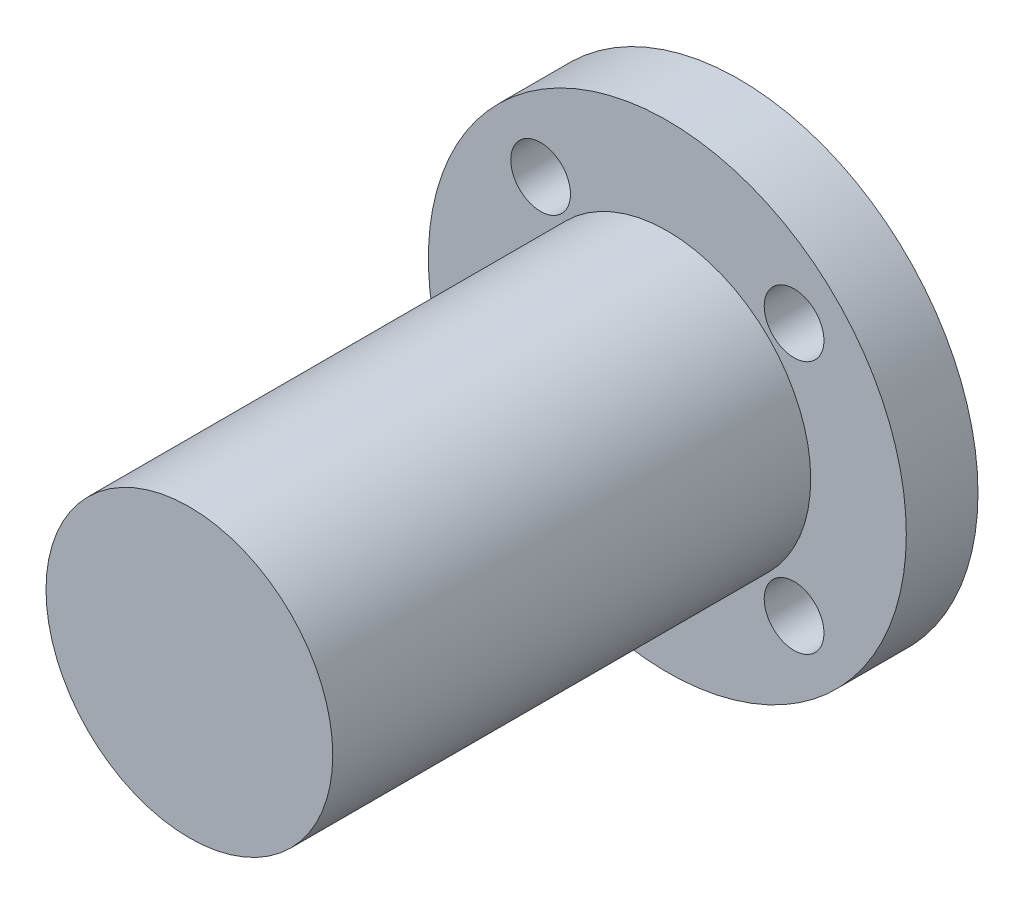
ISO-10303-21;
HEADER;
FILE_DESCRIPTION(('STEP AP214'),'2;1');
FILE_NAME('part.step','',(''),(''),'','','');
FILE_SCHEMA(('AUTOMOTIVE_DESIGN { 1 0 10303 214 1 1 1 1 }'));
ENDSEC;
DATA;
#1=APPLICATION_CONTEXT('core data for automotive mechanical design processes');
#2=APPLICATION_PROTOCOL_DEFINITION('international standard','automotive_design',2000,#1);
#3=PRODUCT_CONTEXT('',#1,'mechanical');
#4=PRODUCT('Part','Part','',(#3));
#5=PRODUCT_RELATED_PRODUCT_CATEGORY('part','',(#4));
#6=PRODUCT_DEFINITION_FORMATION('','',#4);
#7=PRODUCT_DEFINITION_CONTEXT('part definition',#1,'design');
#8=PRODUCT_DEFINITION('design','',#6,#7);
#9=PRODUCT_DEFINITION_SHAPE('','',#8);
#10=(LENGTH_UNIT() NAMED_UNIT(*) SI_UNIT(.MILLI.,.METRE.));
#11=(NAMED_UNIT(*) PLANE_ANGLE_UNIT() SI_UNIT($,.RADIAN.));
#12=(NAMED_UNIT(*) SI_UNIT($,.STERADIAN.) SOLID_ANGLE_UNIT());
#13=UNCERTAINTY_MEASURE_WITH_UNIT(LENGTH_MEASURE(1.E-05),#10,'distance_accuracy_value','');
#14=(GEOMETRIC_REPRESENTATION_CONTEXT(3) GLOBAL_UNCERTAINTY_ASSIGNED_CONTEXT((#13)) GLOBAL_UNIT_ASSIGNED_CONTEXT((#10,
#11,#12)) REPRESENTATION_CONTEXT('',''));
#15=CARTESIAN_POINT('',(0.,0.,0.));
#16=DIRECTION('',(0.,0.,1.));
#17=DIRECTION('',(1.,0.,0.));
#18=AXIS2_PLACEMENT_3D('',#15,#16,#17);
#19=CARTESIAN_POINT('',(0.,0.,3.));
#20=DIRECTION('',(0.,0.,-1.));
#21=DIRECTION('',(-1.,0.,0.));
#22=AXIS2_PLACEMENT_3D('',#19,#20,#21);
#23=CYLINDRICAL_SURFACE('',#22,10.);
#24=CARTESIAN_POINT('',(0.,0.,3.));
#25=DIRECTION('',(0.,0.,1.));
#26=DIRECTION('',(1.,0.,0.));
#27=AXIS2_PLACEMENT_3D('',#24,#25,#26);
#28=CIRCLE('',#27,10.);
#29=CARTESIAN_POINT('',(10.,0.,3.));
#30=VERTEX_POINT('',#29);
#31=EDGE_CURVE('E42',#30,#30,#28,.T.);
#32=ORIENTED_EDGE('',*,*,#31,.F.);
#33=EDGE_LOOP('',(#32));
#34=FACE_BOUND('',#33,.T.);
#35=CARTESIAN_POINT('',(0.,0.,0.));
#36=DIRECTION('',(0.,0.,1.));
#37=DIRECTION('',(1.,0.,0.));
#38=AXIS2_PLACEMENT_3D('',#35,#36,#37);
#39=CIRCLE('',#38,10.);
#40=CARTESIAN_POINT('',(10.,0.,0.));
#41=VERTEX_POINT('',#40);
#42=EDGE_CURVE('E38',#41,#41,#39,.T.);
#43=ORIENTED_EDGE('',*,*,#42,.T.);
#44=EDGE_LOOP('',(#43));
#45=FACE_BOUND('',#44,.T.);
#46=ADVANCED_FACE('F35',(#34,#45),#23,.T.);
#47=CARTESIAN_POINT('',(0.,0.,3.));
#48=DIRECTION('',(0.,0.,1.));
#49=DIRECTION('',(1.,0.,0.));
#50=AXIS2_PLACEMENT_3D('',#47,#48,#49);
#51=PLANE('',#50);
#52=CARTESIAN_POINT('',(5.3033008588991,-5.30330085889911,3.));
#53=DIRECTION('',(0.,0.,1.));
#54=DIRECTION('',(1.,0.,0.));
#55=AXIS2_PLACEMENT_3D('',#52,#53,#54);
#56=CIRCLE('',#55,1.25);
#57=CARTESIAN_POINT('',(6.5533008588991,-5.30330085889911,3.));
#58=VERTEX_POINT('',#57);
#59=EDGE_CURVE('E61',#58,#58,#56,.F.);
#60=ORIENTED_EDGE('',*,*,#59,.T.);
#61=EDGE_LOOP('',(#60));
#62=FACE_BOUND('',#61,.T.);
#63=CARTESIAN_POINT('',(-5.30330085889911,-5.30330085889911,3.));
#64=DIRECTION('',(0.,0.,1.));
#65=DIRECTION('',(1.,0.,0.));
#66=AXIS2_PLACEMENT_3D('',#63,#64,#65);
#67=CIRCLE('',#66,1.25);
#68=CARTESIAN_POINT('',(-4.05330085889911,-5.30330085889911,3.));
#69=VERTEX_POINT('',#68);
#70=EDGE_CURVE('E67',#69,#69,#67,.F.);
#71=ORIENTED_EDGE('',*,*,#70,.T.);
#72=EDGE_LOOP('',(#71));
#73=FACE_BOUND('',#72,.T.);
#74=CARTESIAN_POINT('',(-5.30330085889911,5.30330085889911,3.));
#75=DIRECTION('',(0.,0.,1.));
#76=DIRECTION('',(1.,0.,0.));
#77=AXIS2_PLACEMENT_3D('',#74,#75,#76);
#78=CIRCLE('',#77,1.25);
#79=CARTESIAN_POINT('',(-4.05330085889911,5.30330085889911,3.));
#80=VERTEX_POINT('',#79);
#81=EDGE_CURVE('E55',#80,#80,#78,.F.);
#82=ORIENTED_EDGE('',*,*,#81,.T.);
#83=EDGE_LOOP('',(#82));
#84=FACE_BOUND('',#83,.T.);
#85=CARTESIAN_POINT('',(5.3033008588991,5.3033008588991,3.));
#86=DIRECTION('',(0.,0.,1.));
#87=DIRECTION('',(1.,0.,0.));
#88=AXIS2_PLACEMENT_3D('',#85,#86,#87);
#89=CIRCLE('',#88,1.25);
#90=CARTESIAN_POINT('',(6.5533008588991,5.3033008588991,3.));
#91=VERTEX_POINT('',#90);
#92=EDGE_CURVE('E52',#91,#91,#89,.F.);
#93=ORIENTED_EDGE('',*,*,#92,.T.);
#94=EDGE_LOOP('',(#93));
#95=FACE_BOUND('',#94,.T.);
#96=CARTESIAN_POINT('',(0.,0.,3.));
#97=DIRECTION('',(0.,0.,1.));
#98=DIRECTION('',(1.,0.,0.));
#99=AXIS2_PLACEMENT_3D('',#96,#97,#98);
#100=CIRCLE('',#99,6.);
#101=CARTESIAN_POINT('',(6.,0.,3.));
#102=VERTEX_POINT('',#101);
#103=EDGE_CURVE('E10',#102,#102,#100,.T.);
#104=ORIENTED_EDGE('',*,*,#103,.F.);
#105=EDGE_LOOP('',(#104));
#106=FACE_BOUND('',#105,.T.);
#107=ORIENTED_EDGE('',*,*,#31,.T.);
#108=EDGE_LOOP('',(#107));
#109=FACE_BOUND('',#108,.T.);
#110=ADVANCED_FACE('F76',(#62,#73,#84,#95,#106,#109),#51,.T.);
#111=CARTESIAN_POINT('',(0.,0.,0.));
#112=DIRECTION('',(0.,0.,1.));
#113=DIRECTION('',(1.,0.,0.));
#114=AXIS2_PLACEMENT_3D('',#111,#112,#113);
#115=PLANE('',#114);
#116=CARTESIAN_POINT('',(5.3033008588991,-5.30330085889911,0.));
#117=DIRECTION('',(0.,0.,-1.));
#118=DIRECTION('',(-1.,0.,0.));
#119=AXIS2_PLACEMENT_3D('',#116,#117,#118);
#120=CIRCLE('',#119,1.25);
#121=CARTESIAN_POINT('',(4.0533008588991,-5.30330085889911,0.));
#122=VERTEX_POINT('',#121);
#123=EDGE_CURVE('E58',#122,#122,#120,.T.);
#124=ORIENTED_EDGE('',*,*,#123,.F.);
#125=EDGE_LOOP('',(#124));
#126=FACE_BOUND('',#125,.T.);
#127=CARTESIAN_POINT('',(-5.30330085889911,-5.30330085889911,0.));
#128=DIRECTION('',(0.,0.,-1.));
#129=DIRECTION('',(-1.,0.,0.));
#130=AXIS2_PLACEMENT_3D('',#127,#128,#129);
#131=CIRCLE('',#130,1.25);
#132=CARTESIAN_POINT('',(-6.55330085889911,-5.30330085889911,0.));
#133=VERTEX_POINT('',#132);
#134=EDGE_CURVE('E64',#133,#133,#131,.T.);
#135=ORIENTED_EDGE('',*,*,#134,.F.);
#136=EDGE_LOOP('',(#135));
#137=FACE_BOUND('',#136,.T.);
#138=CARTESIAN_POINT('',(-5.30330085889911,5.30330085889911,0.));
#139=DIRECTION('',(0.,0.,-1.));
#140=DIRECTION('',(-1.,0.,0.));
#141=AXIS2_PLACEMENT_3D('',#138,#139,#140);
#142=CIRCLE('',#141,1.25);
#143=CARTESIAN_POINT('',(-6.55330085889911,5.30330085889911,0.));
#144=VERTEX_POINT('',#143);
#145=EDGE_CURVE('E70',#144,#144,#142,.T.);
#146=ORIENTED_EDGE('',*,*,#145,.F.);
#147=EDGE_LOOP('',(#146));
#148=FACE_BOUND('',#147,.T.);
#149=CARTESIAN_POINT('',(5.3033008588991,5.3033008588991,0.));
#150=DIRECTION('',(0.,0.,-1.));
#151=DIRECTION('',(-1.,0.,0.));
#152=AXIS2_PLACEMENT_3D('',#149,#150,#151);
#153=CIRCLE('',#152,1.25);
#154=CARTESIAN_POINT('',(4.0533008588991,5.3033008588991,0.));
#155=VERTEX_POINT('',#154);
#156=EDGE_CURVE('E51',#155,#155,#153,.T.);
#157=ORIENTED_EDGE('',*,*,#156,.F.);
#158=EDGE_LOOP('',(#157));
#159=FACE_BOUND('',#158,.T.);
#160=ORIENTED_EDGE('',*,*,#42,.F.);
#161=EDGE_LOOP('',(#160));
#162=FACE_BOUND('',#161,.T.);
#163=ADVANCED_FACE('F87',(#126,#137,#148,#159,#162),#115,.F.);
#164=CARTESIAN_POINT('',(0.,0.,23.));
#165=DIRECTION('',(0.,0.,-1.));
#166=DIRECTION('',(-1.,0.,0.));
#167=AXIS2_PLACEMENT_3D('',#164,#165,#166);
#168=CYLINDRICAL_SURFACE('',#167,6.);
#169=CARTESIAN_POINT('',(0.,0.,23.));
#170=DIRECTION('',(0.,0.,1.));
#171=DIRECTION('',(1.,0.,0.));
#172=AXIS2_PLACEMENT_3D('',#169,#170,#171);
#173=CIRCLE('',#172,6.);
#174=CARTESIAN_POINT('',(6.,0.,23.));
#175=VERTEX_POINT('',#174);
#176=EDGE_CURVE('E48',#175,#175,#173,.T.);
#177=ORIENTED_EDGE('',*,*,#176,.F.);
#178=EDGE_LOOP('',(#177));
#179=FACE_BOUND('',#178,.T.);
#180=ORIENTED_EDGE('',*,*,#103,.T.);
#181=EDGE_LOOP('',(#180));
#182=FACE_BOUND('',#181,.T.);
#183=ADVANCED_FACE('F90',(#179,#182),#168,.T.);
#184=CARTESIAN_POINT('',(0.,0.,23.));
#185=DIRECTION('',(0.,0.,1.));
#186=DIRECTION('',(1.,0.,0.));
#187=AXIS2_PLACEMENT_3D('',#184,#185,#186);
#188=PLANE('',#187);
#189=ORIENTED_EDGE('',*,*,#176,.T.);
#190=EDGE_LOOP('',(#189));
#191=FACE_BOUND('',#190,.T.);
#192=ADVANCED_FACE('F112',(#191),#188,.T.);
#193=CARTESIAN_POINT('',(5.3033008588991,5.3033008588991,23.001));
#194=DIRECTION('',(0.,0.,-1.));
#195=DIRECTION('',(-1.,0.,0.));
#196=AXIS2_PLACEMENT_3D('',#193,#194,#195);
#197=CYLINDRICAL_SURFACE('',#196,1.25);
#198=ORIENTED_EDGE('',*,*,#92,.F.);
#199=EDGE_LOOP('',(#198));
#200=FACE_BOUND('',#199,.T.);
#201=ORIENTED_EDGE('',*,*,#156,.T.);
#202=EDGE_LOOP('',(#201));
#203=FACE_BOUND('',#202,.T.);
#204=ADVANCED_FACE('F83',(#200,#203),#197,.F.);
#205=CARTESIAN_POINT('',(-5.30330085889911,5.30330085889911,23.001));
#206=DIRECTION('',(0.,0.,-1.));
#207=DIRECTION('',(-1.,0.,0.));
#208=AXIS2_PLACEMENT_3D('',#205,#206,#207);
#209=CYLINDRICAL_SURFACE('',#208,1.25);
#210=ORIENTED_EDGE('',*,*,#81,.F.);
#211=EDGE_LOOP('',(#210));
#212=FACE_BOUND('',#211,.T.);
#213=ORIENTED_EDGE('',*,*,#145,.T.);
#214=EDGE_LOOP('',(#213));
#215=FACE_BOUND('',#214,.T.);
#216=ADVANCED_FACE('F79',(#212,#215),#209,.F.);
#217=CARTESIAN_POINT('',(-5.30330085889911,-5.30330085889911,23.001));
#218=DIRECTION('',(0.,0.,-1.));
#219=DIRECTION('',(-1.,0.,0.));
#220=AXIS2_PLACEMENT_3D('',#217,#218,#219);
#221=CYLINDRICAL_SURFACE('',#220,1.25);
#222=ORIENTED_EDGE('',*,*,#70,.F.);
#223=EDGE_LOOP('',(#222));
#224=FACE_BOUND('',#223,.T.);
#225=ORIENTED_EDGE('',*,*,#134,.T.);
#226=EDGE_LOOP('',(#225));
#227=FACE_BOUND('',#226,.T.);
#228=ADVANCED_FACE('F82',(#224,#227),#221,.F.);
#229=CARTESIAN_POINT('',(5.3033008588991,-5.30330085889911,23.001));
#230=DIRECTION('',(0.,0.,-1.));
#231=DIRECTION('',(-1.,0.,0.));
#232=AXIS2_PLACEMENT_3D('',#229,#230,#231);
#233=CYLINDRICAL_SURFACE('',#232,1.25);
#234=ORIENTED_EDGE('',*,*,#59,.F.);
#235=EDGE_LOOP('',(#234));
#236=FACE_BOUND('',#235,.T.);
#237=ORIENTED_EDGE('',*,*,#123,.T.);
#238=EDGE_LOOP('',(#237));
#239=FACE_BOUND('',#238,.T.);
#240=ADVANCED_FACE('F120',(#236,#239),#233,.F.);
#241=CLOSED_SHELL('',(#46,#110,#163,#183,#192,#204,#216,#228,#240));
#242=MANIFOLD_SOLID_BREP('B2',#241);
#243=ADVANCED_BREP_SHAPE_REPRESENTATION('',(#18,#242),#14);
#244=SHAPE_DEFINITION_REPRESENTATION(#9,#243);
ENDSEC;
END-ISO-10303-21;
